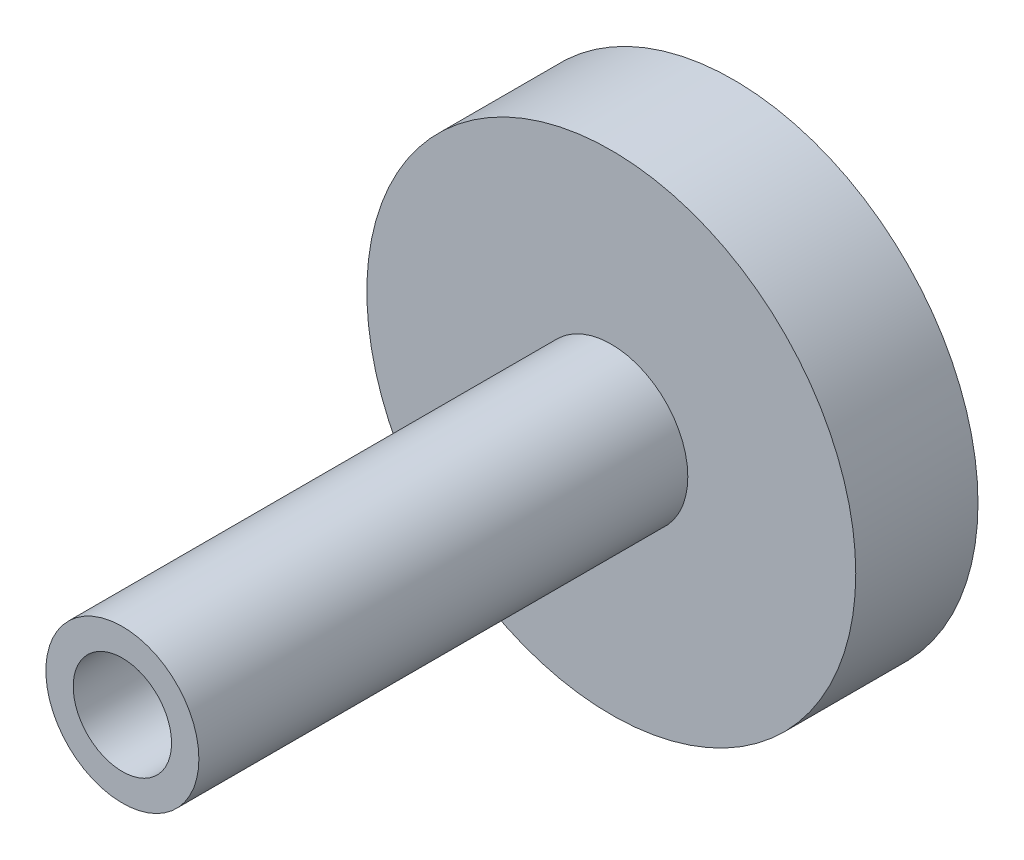
ISO-10303-21;
HEADER;
FILE_DESCRIPTION(('STEP AP214'),'2;1');
FILE_NAME('part.step','',(''),(''),'','','');
FILE_SCHEMA(('AUTOMOTIVE_DESIGN { 1 0 10303 214 1 1 1 1 }'));
ENDSEC;
DATA;
#1=APPLICATION_CONTEXT('core data for automotive mechanical design processes');
#2=APPLICATION_PROTOCOL_DEFINITION('international standard','automotive_design',2000,#1);
#3=PRODUCT_CONTEXT('',#1,'mechanical');
#4=PRODUCT('Part','Part','',(#3));
#5=PRODUCT_RELATED_PRODUCT_CATEGORY('part','',(#4));
#6=PRODUCT_DEFINITION_FORMATION('','',#4);
#7=PRODUCT_DEFINITION_CONTEXT('part definition',#1,'design');
#8=PRODUCT_DEFINITION('design','',#6,#7);
#9=PRODUCT_DEFINITION_SHAPE('','',#8);
#10=(LENGTH_UNIT() NAMED_UNIT(*) SI_UNIT(.MILLI.,.METRE.));
#11=(NAMED_UNIT(*) PLANE_ANGLE_UNIT() SI_UNIT($,.RADIAN.));
#12=(NAMED_UNIT(*) SI_UNIT($,.STERADIAN.) SOLID_ANGLE_UNIT());
#13=UNCERTAINTY_MEASURE_WITH_UNIT(LENGTH_MEASURE(1.E-05),#10,'distance_accuracy_value','');
#14=(GEOMETRIC_REPRESENTATION_CONTEXT(3) GLOBAL_UNCERTAINTY_ASSIGNED_CONTEXT((#13)) GLOBAL_UNIT_ASSIGNED_CONTEXT((#10,
#11,#12)) REPRESENTATION_CONTEXT('',''));
#15=CARTESIAN_POINT('',(0.,0.,0.));
#16=DIRECTION('',(0.,0.,1.));
#17=DIRECTION('',(1.,0.,0.));
#18=AXIS2_PLACEMENT_3D('',#15,#16,#17);
#19=CARTESIAN_POINT('',(0.,0.,31.75));
#20=DIRECTION('',(0.,0.,1.));
#21=DIRECTION('',(1.,0.,0.));
#22=AXIS2_PLACEMENT_3D('',#19,#20,#21);
#23=PLANE('',#22);
#24=CARTESIAN_POINT('',(0.,0.,31.75));
#25=DIRECTION('',(0.,0.,1.));
#26=DIRECTION('',(1.,0.,0.));
#27=AXIS2_PLACEMENT_3D('',#24,#25,#26);
#28=CIRCLE('',#27,2.555);
#29=CARTESIAN_POINT('',(2.555,0.,31.75));
#30=VERTEX_POINT('',#29);
#31=EDGE_CURVE('E43',#30,#30,#28,.T.);
#32=ORIENTED_EDGE('',*,*,#31,.F.);
#33=EDGE_LOOP('',(#32));
#34=FACE_BOUND('',#33,.T.);
#35=CARTESIAN_POINT('',(0.,0.,31.75));
#36=DIRECTION('',(0.,0.,1.));
#37=DIRECTION('',(1.,0.,0.));
#38=AXIS2_PLACEMENT_3D('',#35,#36,#37);
#39=CIRCLE('',#38,3.9751);
#40=CARTESIAN_POINT('',(3.9751,0.,31.75));
#41=VERTEX_POINT('',#40);
#42=EDGE_CURVE('E57',#41,#41,#39,.T.);
#43=ORIENTED_EDGE('',*,*,#42,.T.);
#44=EDGE_LOOP('',(#43));
#45=FACE_BOUND('',#44,.T.);
#46=ADVANCED_FACE('F36',(#34,#45),#23,.T.);
#47=CARTESIAN_POINT('',(0.,0.,31.75));
#48=DIRECTION('',(0.,0.,-1.));
#49=DIRECTION('',(-1.,0.,0.));
#50=AXIS2_PLACEMENT_3D('',#47,#48,#49);
#51=CYLINDRICAL_SURFACE('',#50,12.7);
#52=CARTESIAN_POINT('',(0.,0.,0.));
#53=DIRECTION('',(0.,0.,1.));
#54=DIRECTION('',(1.,0.,0.));
#55=AXIS2_PLACEMENT_3D('',#52,#53,#54);
#56=CIRCLE('',#55,12.7);
#57=CARTESIAN_POINT('',(12.7,0.,0.));
#58=VERTEX_POINT('',#57);
#59=EDGE_CURVE('E10',#58,#58,#56,.T.);
#60=ORIENTED_EDGE('',*,*,#59,.T.);
#61=EDGE_LOOP('',(#60));
#62=FACE_BOUND('',#61,.T.);
#63=CARTESIAN_POINT('',(0.,0.,6.35));
#64=DIRECTION('',(0.,0.,1.));
#65=DIRECTION('',(1.,0.,0.));
#66=AXIS2_PLACEMENT_3D('',#63,#64,#65);
#67=CIRCLE('',#66,12.7);
#68=CARTESIAN_POINT('',(12.7,0.,6.35));
#69=VERTEX_POINT('',#68);
#70=EDGE_CURVE('E52',#69,#69,#67,.T.);
#71=ORIENTED_EDGE('',*,*,#70,.F.);
#72=EDGE_LOOP('',(#71));
#73=FACE_BOUND('',#72,.T.);
#74=ADVANCED_FACE('F38',(#62,#73),#51,.T.);
#75=CARTESIAN_POINT('',(0.,0.,0.));
#76=DIRECTION('',(0.,0.,1.));
#77=DIRECTION('',(1.,0.,0.));
#78=AXIS2_PLACEMENT_3D('',#75,#76,#77);
#79=PLANE('',#78);
#80=ORIENTED_EDGE('',*,*,#59,.F.);
#81=EDGE_LOOP('',(#80));
#82=FACE_BOUND('',#81,.T.);
#83=CARTESIAN_POINT('',(0.,0.,0.));
#84=DIRECTION('',(0.,0.,1.));
#85=DIRECTION('',(1.,0.,0.));
#86=AXIS2_PLACEMENT_3D('',#83,#84,#85);
#87=CIRCLE('',#86,2.555);
#88=CARTESIAN_POINT('',(2.555,0.,0.));
#89=VERTEX_POINT('',#88);
#90=EDGE_CURVE('E47',#89,#89,#87,.T.);
#91=ORIENTED_EDGE('',*,*,#90,.T.);
#92=EDGE_LOOP('',(#91));
#93=FACE_BOUND('',#92,.T.);
#94=ADVANCED_FACE('F74',(#82,#93),#79,.F.);
#95=CARTESIAN_POINT('',(0.,0.,31.75));
#96=DIRECTION('',(0.,0.,-1.));
#97=DIRECTION('',(-1.,0.,0.));
#98=AXIS2_PLACEMENT_3D('',#95,#96,#97);
#99=CYLINDRICAL_SURFACE('',#98,2.555);
#100=ORIENTED_EDGE('',*,*,#31,.T.);
#101=EDGE_LOOP('',(#100));
#102=FACE_BOUND('',#101,.T.);
#103=ORIENTED_EDGE('',*,*,#90,.F.);
#104=EDGE_LOOP('',(#103));
#105=FACE_BOUND('',#104,.T.);
#106=ADVANCED_FACE('F69',(#102,#105),#99,.F.);
#107=CARTESIAN_POINT('',(0.,0.,6.35));
#108=DIRECTION('',(0.,0.,1.));
#109=DIRECTION('',(1.,0.,0.));
#110=AXIS2_PLACEMENT_3D('',#107,#108,#109);
#111=PLANE('',#110);
#112=CARTESIAN_POINT('',(0.,0.,6.35));
#113=DIRECTION('',(0.,0.,1.));
#114=DIRECTION('',(1.,0.,0.));
#115=AXIS2_PLACEMENT_3D('',#112,#113,#114);
#116=CIRCLE('',#115,3.9751);
#117=CARTESIAN_POINT('',(3.9751,0.,6.35));
#118=VERTEX_POINT('',#117);
#119=EDGE_CURVE('E56',#118,#118,#116,.T.);
#120=ORIENTED_EDGE('',*,*,#119,.F.);
#121=EDGE_LOOP('',(#120));
#122=FACE_BOUND('',#121,.T.);
#123=ORIENTED_EDGE('',*,*,#70,.T.);
#124=EDGE_LOOP('',(#123));
#125=FACE_BOUND('',#124,.T.);
#126=ADVANCED_FACE('F66',(#122,#125),#111,.T.);
#127=CARTESIAN_POINT('',(0.,0.,6.35));
#128=DIRECTION('',(0.,0.,1.));
#129=DIRECTION('',(1.,0.,0.));
#130=AXIS2_PLACEMENT_3D('',#127,#128,#129);
#131=CYLINDRICAL_SURFACE('',#130,3.9751);
#132=ORIENTED_EDGE('',*,*,#119,.T.);
#133=EDGE_LOOP('',(#132));
#134=FACE_BOUND('',#133,.T.);
#135=ORIENTED_EDGE('',*,*,#42,.F.);
#136=EDGE_LOOP('',(#135));
#137=FACE_BOUND('',#136,.T.);
#138=ADVANCED_FACE('F63',(#134,#137),#131,.T.);
#139=CLOSED_SHELL('',(#46,#74,#94,#106,#126,#138));
#140=MANIFOLD_SOLID_BREP('B2',#139);
#141=ADVANCED_BREP_SHAPE_REPRESENTATION('',(#18,#140),#14);
#142=SHAPE_DEFINITION_REPRESENTATION(#9,#141);
ENDSEC;
END-ISO-10303-21;
